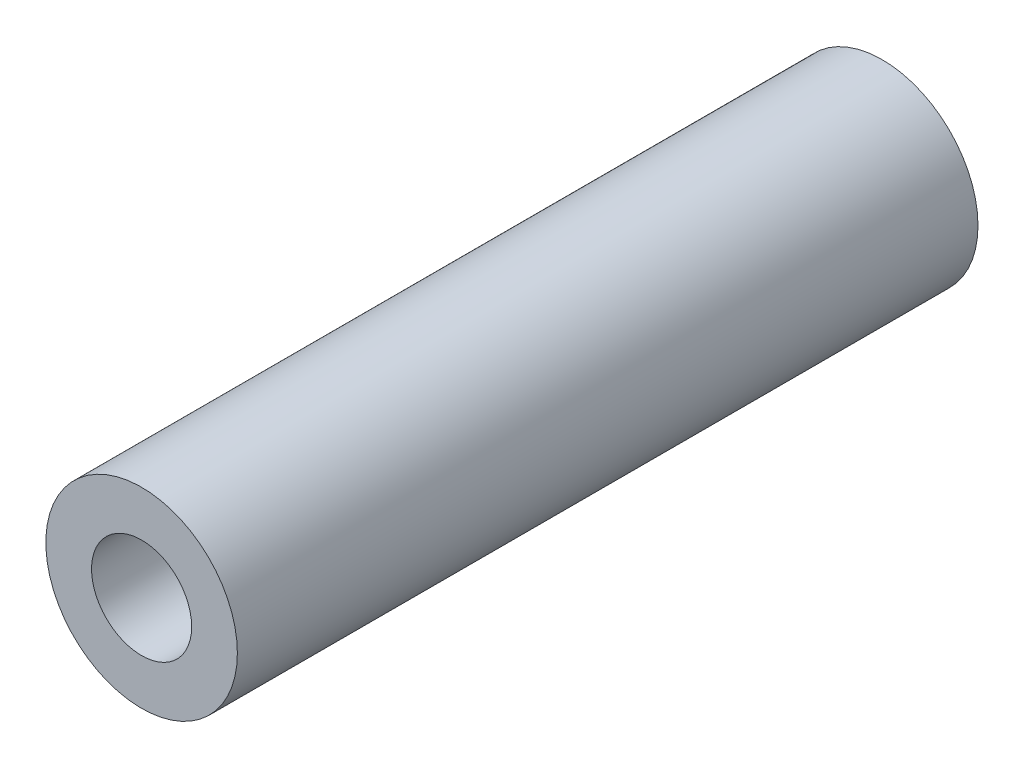
ISO-10303-21;
HEADER;
FILE_DESCRIPTION(('STEP AP214'),'2;1');
FILE_NAME('part.step','',(''),(''),'','','');
FILE_SCHEMA(('AUTOMOTIVE_DESIGN { 1 0 10303 214 1 1 1 1 }'));
ENDSEC;
DATA;
#1=APPLICATION_CONTEXT('core data for automotive mechanical design processes');
#2=APPLICATION_PROTOCOL_DEFINITION('international standard','automotive_design',2000,#1);
#3=PRODUCT_CONTEXT('',#1,'mechanical');
#4=PRODUCT('Part','Part','',(#3));
#5=PRODUCT_RELATED_PRODUCT_CATEGORY('part','',(#4));
#6=PRODUCT_DEFINITION_FORMATION('','',#4);
#7=PRODUCT_DEFINITION_CONTEXT('part definition',#1,'design');
#8=PRODUCT_DEFINITION('design','',#6,#7);
#9=PRODUCT_DEFINITION_SHAPE('','',#8);
#10=(LENGTH_UNIT() NAMED_UNIT(*) SI_UNIT(.MILLI.,.METRE.));
#11=(NAMED_UNIT(*) PLANE_ANGLE_UNIT() SI_UNIT($,.RADIAN.));
#12=(NAMED_UNIT(*) SI_UNIT($,.STERADIAN.) SOLID_ANGLE_UNIT());
#13=UNCERTAINTY_MEASURE_WITH_UNIT(LENGTH_MEASURE(1.E-05),#10,'distance_accuracy_value','');
#14=(GEOMETRIC_REPRESENTATION_CONTEXT(3) GLOBAL_UNCERTAINTY_ASSIGNED_CONTEXT((#13)) GLOBAL_UNIT_ASSIGNED_CONTEXT((#10,
#11,#12)) REPRESENTATION_CONTEXT('',''));
#15=CARTESIAN_POINT('',(0.,0.,0.));
#16=DIRECTION('',(0.,0.,1.));
#17=DIRECTION('',(1.,0.,0.));
#18=AXIS2_PLACEMENT_3D('',#15,#16,#17);
#19=CARTESIAN_POINT('',(0.,0.,18.415));
#20=DIRECTION('',(0.,0.,1.));
#21=DIRECTION('',(1.,0.,0.));
#22=AXIS2_PLACEMENT_3D('',#19,#20,#21);
#23=PLANE('',#22);
#24=CARTESIAN_POINT('',(0.,0.,18.415));
#25=DIRECTION('',(0.,0.,1.));
#26=DIRECTION('',(1.,0.,0.));
#27=AXIS2_PLACEMENT_3D('',#24,#25,#26);
#28=CIRCLE('',#27,4.7625);
#29=CARTESIAN_POINT('',(4.7625,0.,18.415));
#30=VERTEX_POINT('',#29);
#31=EDGE_CURVE('E10',#30,#30,#28,.T.);
#32=ORIENTED_EDGE('',*,*,#31,.T.);
#33=EDGE_LOOP('',(#32));
#34=FACE_BOUND('',#33,.T.);
#35=CARTESIAN_POINT('',(0.,0.,18.415));
#36=DIRECTION('',(0.,0.,1.));
#37=DIRECTION('',(1.,0.,0.));
#38=AXIS2_PLACEMENT_3D('',#35,#36,#37);
#39=CIRCLE('',#38,2.4892);
#40=CARTESIAN_POINT('',(2.4892,0.,18.415));
#41=VERTEX_POINT('',#40);
#42=EDGE_CURVE('E50',#41,#41,#39,.T.);
#43=ORIENTED_EDGE('',*,*,#42,.F.);
#44=EDGE_LOOP('',(#43));
#45=FACE_BOUND('',#44,.T.);
#46=ADVANCED_FACE('F39',(#34,#45),#23,.T.);
#47=CARTESIAN_POINT('',(0.,0.,-18.415));
#48=DIRECTION('',(0.,0.,1.));
#49=DIRECTION('',(1.,0.,0.));
#50=AXIS2_PLACEMENT_3D('',#47,#48,#49);
#51=PLANE('',#50);
#52=CARTESIAN_POINT('',(0.,0.,-18.415));
#53=DIRECTION('',(0.,0.,1.));
#54=DIRECTION('',(1.,0.,0.));
#55=AXIS2_PLACEMENT_3D('',#52,#53,#54);
#56=CIRCLE('',#55,4.7625);
#57=CARTESIAN_POINT('',(4.7625,0.,-18.415));
#58=VERTEX_POINT('',#57);
#59=EDGE_CURVE('E43',#58,#58,#56,.T.);
#60=ORIENTED_EDGE('',*,*,#59,.F.);
#61=EDGE_LOOP('',(#60));
#62=FACE_BOUND('',#61,.T.);
#63=CARTESIAN_POINT('',(0.,0.,-18.415));
#64=DIRECTION('',(0.,0.,1.));
#65=DIRECTION('',(1.,0.,0.));
#66=AXIS2_PLACEMENT_3D('',#63,#64,#65);
#67=CIRCLE('',#66,2.4892);
#68=CARTESIAN_POINT('',(2.4892,0.,-18.415));
#69=VERTEX_POINT('',#68);
#70=EDGE_CURVE('E52',#69,#69,#67,.T.);
#71=ORIENTED_EDGE('',*,*,#70,.T.);
#72=EDGE_LOOP('',(#71));
#73=FACE_BOUND('',#72,.T.);
#74=ADVANCED_FACE('F62',(#62,#73),#51,.F.);
#75=CARTESIAN_POINT('',(0.,0.,18.415));
#76=DIRECTION('',(0.,0.,-1.));
#77=DIRECTION('',(-1.,0.,0.));
#78=AXIS2_PLACEMENT_3D('',#75,#76,#77);
#79=CYLINDRICAL_SURFACE('',#78,4.7625);
#80=ORIENTED_EDGE('',*,*,#31,.F.);
#81=EDGE_LOOP('',(#80));
#82=FACE_BOUND('',#81,.T.);
#83=ORIENTED_EDGE('',*,*,#59,.T.);
#84=EDGE_LOOP('',(#83));
#85=FACE_BOUND('',#84,.T.);
#86=ADVANCED_FACE('F41',(#82,#85),#79,.T.);
#87=CARTESIAN_POINT('',(0.,0.,18.415));
#88=DIRECTION('',(0.,0.,-1.));
#89=DIRECTION('',(-1.,0.,0.));
#90=AXIS2_PLACEMENT_3D('',#87,#88,#89);
#91=CYLINDRICAL_SURFACE('',#90,2.4892);
#92=ORIENTED_EDGE('',*,*,#42,.T.);
#93=EDGE_LOOP('',(#92));
#94=FACE_BOUND('',#93,.T.);
#95=ORIENTED_EDGE('',*,*,#70,.F.);
#96=EDGE_LOOP('',(#95));
#97=FACE_BOUND('',#96,.T.);
#98=ADVANCED_FACE('F58',(#94,#97),#91,.F.);
#99=CLOSED_SHELL('',(#46,#74,#86,#98));
#100=MANIFOLD_SOLID_BREP('B2',#99);
#101=ADVANCED_BREP_SHAPE_REPRESENTATION('',(#18,#100),#14);
#102=SHAPE_DEFINITION_REPRESENTATION(#9,#101);
ENDSEC;
END-ISO-10303-21;
